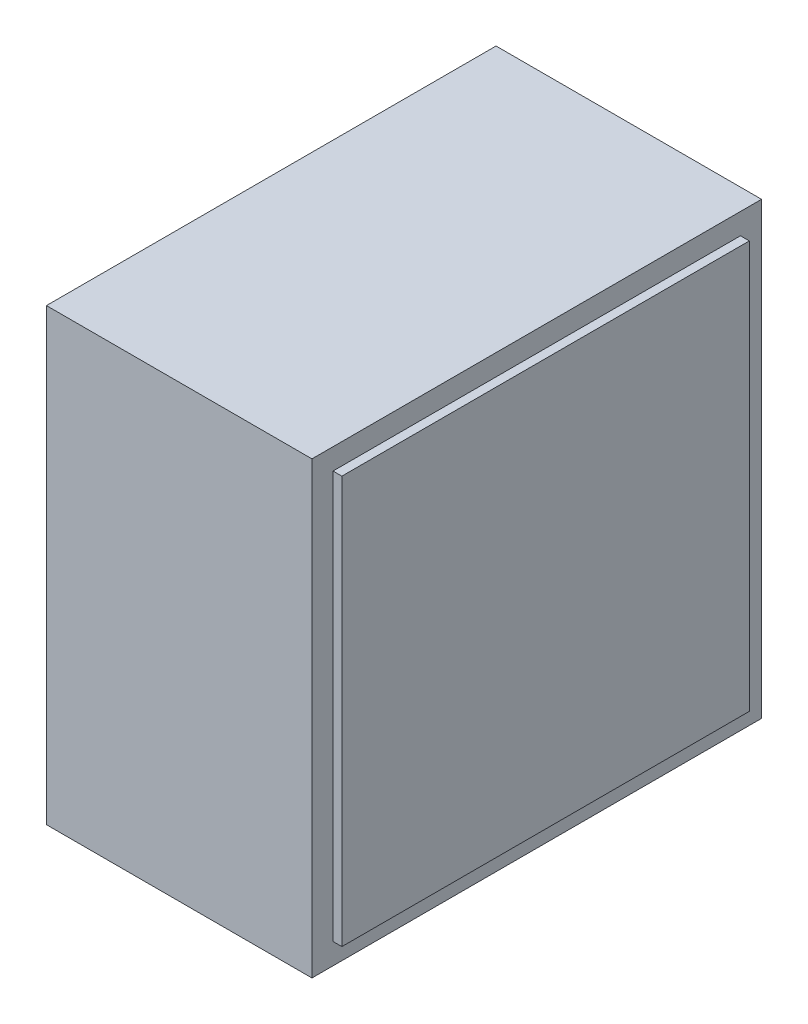
ISO-10303-21;
HEADER;
FILE_DESCRIPTION(('STEP AP214'),'2;1');
FILE_NAME('part.step','',(''),(''),'','','');
FILE_SCHEMA(('AUTOMOTIVE_DESIGN { 1 0 10303 214 1 1 1 1 }'));
ENDSEC;
DATA;
#1=APPLICATION_CONTEXT('core data for automotive mechanical design processes');
#2=APPLICATION_PROTOCOL_DEFINITION('international standard','automotive_design',2000,#1);
#3=PRODUCT_CONTEXT('',#1,'mechanical');
#4=PRODUCT('Part','Part','',(#3));
#5=PRODUCT_RELATED_PRODUCT_CATEGORY('part','',(#4));
#6=PRODUCT_DEFINITION_FORMATION('','',#4);
#7=PRODUCT_DEFINITION_CONTEXT('part definition',#1,'design');
#8=PRODUCT_DEFINITION('design','',#6,#7);
#9=PRODUCT_DEFINITION_SHAPE('','',#8);
#10=(LENGTH_UNIT() NAMED_UNIT(*) SI_UNIT(.MILLI.,.METRE.));
#11=(NAMED_UNIT(*) PLANE_ANGLE_UNIT() SI_UNIT($,.RADIAN.));
#12=(NAMED_UNIT(*) SI_UNIT($,.STERADIAN.) SOLID_ANGLE_UNIT());
#13=UNCERTAINTY_MEASURE_WITH_UNIT(LENGTH_MEASURE(1.E-05),#10,'distance_accuracy_value','');
#14=(GEOMETRIC_REPRESENTATION_CONTEXT(3) GLOBAL_UNCERTAINTY_ASSIGNED_CONTEXT((#13)) GLOBAL_UNIT_ASSIGNED_CONTEXT((#10,
#11,#12)) REPRESENTATION_CONTEXT('',''));
#15=CARTESIAN_POINT('',(0.,0.,0.));
#16=DIRECTION('',(0.,0.,1.));
#17=DIRECTION('',(1.,0.,0.));
#18=AXIS2_PLACEMENT_3D('',#15,#16,#17);
#19=CARTESIAN_POINT('',(62.,-46.0375,-46.0375));
#20=DIRECTION('',(0.,0.,1.));
#21=DIRECTION('',(0.,-1.,0.));
#22=AXIS2_PLACEMENT_3D('',#19,#20,#21);
#23=PLANE('',#22);
#24=DIRECTION('',(0.,1.,0.));
#25=VECTOR('',#24,1.);
#26=CARTESIAN_POINT('',(60.,-46.0375,-46.0375));
#27=LINE('',#26,#25);
#28=CARTESIAN_POINT('',(60.,-46.0375,-46.0375));
#29=VERTEX_POINT('',#28);
#30=CARTESIAN_POINT('',(60.,46.0375,-46.0375));
#31=VERTEX_POINT('',#30);
#32=EDGE_CURVE('E124',#29,#31,#27,.T.);
#33=ORIENTED_EDGE('',*,*,#32,.T.);
#34=DIRECTION('',(-1.,0.,0.));
#35=VECTOR('',#34,1.);
#36=CARTESIAN_POINT('',(62.,46.0375,-46.0375));
#37=LINE('',#36,#35);
#38=CARTESIAN_POINT('',(62.,46.0375,-46.0375));
#39=VERTEX_POINT('',#38);
#40=EDGE_CURVE('E12',#39,#31,#37,.T.);
#41=ORIENTED_EDGE('',*,*,#40,.F.);
#42=DIRECTION('',(0.,1.,0.));
#43=VECTOR('',#42,1.);
#44=CARTESIAN_POINT('',(62.,-46.0375,-46.0375));
#45=LINE('',#44,#43);
#46=CARTESIAN_POINT('',(62.,-46.0375,-46.0375));
#47=VERTEX_POINT('',#46);
#48=EDGE_CURVE('E108',#47,#39,#45,.T.);
#49=ORIENTED_EDGE('',*,*,#48,.F.);
#50=DIRECTION('',(-1.,0.,0.));
#51=VECTOR('',#50,1.);
#52=CARTESIAN_POINT('',(62.,-46.0375,-46.0375));
#53=LINE('',#52,#51);
#54=EDGE_CURVE('E117',#47,#29,#53,.T.);
#55=ORIENTED_EDGE('',*,*,#54,.T.);
#56=EDGE_LOOP('',(#33,#41,#49,#55));
#57=FACE_BOUND('',#56,.T.);
#58=ADVANCED_FACE('F59',(#57),#23,.F.);
#59=CARTESIAN_POINT('',(62.,46.0375,-46.0375));
#60=DIRECTION('',(0.,-1.,0.));
#61=DIRECTION('',(0.,0.,-1.));
#62=AXIS2_PLACEMENT_3D('',#59,#60,#61);
#63=PLANE('',#62);
#64=DIRECTION('',(0.,0.,1.));
#65=VECTOR('',#64,1.);
#66=CARTESIAN_POINT('',(60.,46.0375,-46.0375));
#67=LINE('',#66,#65);
#68=CARTESIAN_POINT('',(60.,46.0375,46.0375));
#69=VERTEX_POINT('',#68);
#70=EDGE_CURVE('E114',#31,#69,#67,.T.);
#71=ORIENTED_EDGE('',*,*,#70,.T.);
#72=DIRECTION('',(-1.,0.,0.));
#73=VECTOR('',#72,1.);
#74=CARTESIAN_POINT('',(62.,46.0375,46.0375));
#75=LINE('',#74,#73);
#76=CARTESIAN_POINT('',(62.,46.0375,46.0375));
#77=VERTEX_POINT('',#76);
#78=EDGE_CURVE('E69',#77,#69,#75,.T.);
#79=ORIENTED_EDGE('',*,*,#78,.F.);
#80=DIRECTION('',(0.,0.,1.));
#81=VECTOR('',#80,1.);
#82=CARTESIAN_POINT('',(62.,46.0375,-46.0375));
#83=LINE('',#82,#81);
#84=EDGE_CURVE('E102',#39,#77,#83,.T.);
#85=ORIENTED_EDGE('',*,*,#84,.F.);
#86=ORIENTED_EDGE('',*,*,#40,.T.);
#87=EDGE_LOOP('',(#71,#79,#85,#86));
#88=FACE_BOUND('',#87,.T.);
#89=ADVANCED_FACE('F115',(#88),#63,.F.);
#90=CARTESIAN_POINT('',(62.,46.0375,46.0375));
#91=DIRECTION('',(0.,0.,-1.));
#92=DIRECTION('',(-1.,0.,0.));
#93=AXIS2_PLACEMENT_3D('',#90,#91,#92);
#94=PLANE('',#93);
#95=DIRECTION('',(0.,-1.,0.));
#96=VECTOR('',#95,1.);
#97=CARTESIAN_POINT('',(60.,46.0375,46.0375));
#98=LINE('',#97,#96);
#99=CARTESIAN_POINT('',(60.,-46.0375,46.0375));
#100=VERTEX_POINT('',#99);
#101=EDGE_CURVE('E93',#69,#100,#98,.T.);
#102=ORIENTED_EDGE('',*,*,#101,.T.);
#103=DIRECTION('',(-1.,0.,0.));
#104=VECTOR('',#103,1.);
#105=CARTESIAN_POINT('',(62.,-46.0375,46.0375));
#106=LINE('',#105,#104);
#107=CARTESIAN_POINT('',(62.,-46.0375,46.0375));
#108=VERTEX_POINT('',#107);
#109=EDGE_CURVE('E111',#108,#100,#106,.T.);
#110=ORIENTED_EDGE('',*,*,#109,.F.);
#111=DIRECTION('',(0.,-1.,0.));
#112=VECTOR('',#111,1.);
#113=CARTESIAN_POINT('',(62.,46.0375,46.0375));
#114=LINE('',#113,#112);
#115=EDGE_CURVE('E110',#77,#108,#114,.T.);
#116=ORIENTED_EDGE('',*,*,#115,.F.);
#117=ORIENTED_EDGE('',*,*,#78,.T.);
#118=EDGE_LOOP('',(#102,#110,#116,#117));
#119=FACE_BOUND('',#118,.T.);
#120=ADVANCED_FACE('F113',(#119),#94,.F.);
#121=CARTESIAN_POINT('',(62.,-46.0375,46.0375));
#122=DIRECTION('',(0.,1.,0.));
#123=DIRECTION('',(0.,0.,1.));
#124=AXIS2_PLACEMENT_3D('',#121,#122,#123);
#125=PLANE('',#124);
#126=DIRECTION('',(0.,0.,-1.));
#127=VECTOR('',#126,1.);
#128=CARTESIAN_POINT('',(60.,-46.0375,46.0375));
#129=LINE('',#128,#127);
#130=EDGE_CURVE('E100',#100,#29,#129,.T.);
#131=ORIENTED_EDGE('',*,*,#130,.T.);
#132=ORIENTED_EDGE('',*,*,#54,.F.);
#133=DIRECTION('',(0.,0.,-1.));
#134=VECTOR('',#133,1.);
#135=CARTESIAN_POINT('',(62.,-46.0375,46.0375));
#136=LINE('',#135,#134);
#137=EDGE_CURVE('E74',#108,#47,#136,.T.);
#138=ORIENTED_EDGE('',*,*,#137,.F.);
#139=ORIENTED_EDGE('',*,*,#109,.T.);
#140=EDGE_LOOP('',(#131,#132,#138,#139));
#141=FACE_BOUND('',#140,.T.);
#142=ADVANCED_FACE('F126',(#141),#125,.F.);
#143=CARTESIAN_POINT('',(62.,0.,0.));
#144=DIRECTION('',(1.,0.,0.));
#145=DIRECTION('',(0.,0.,-1.));
#146=AXIS2_PLACEMENT_3D('',#143,#144,#145);
#147=PLANE('',#146);
#148=ORIENTED_EDGE('',*,*,#48,.T.);
#149=ORIENTED_EDGE('',*,*,#84,.T.);
#150=ORIENTED_EDGE('',*,*,#115,.T.);
#151=ORIENTED_EDGE('',*,*,#137,.T.);
#152=EDGE_LOOP('',(#148,#149,#150,#151));
#153=FACE_BOUND('',#152,.T.);
#154=ADVANCED_FACE('F104',(#153),#147,.T.);
#155=CARTESIAN_POINT('',(60.,0.,0.));
#156=DIRECTION('',(1.,0.,0.));
#157=DIRECTION('',(0.,0.,-1.));
#158=AXIS2_PLACEMENT_3D('',#155,#156,#157);
#159=PLANE('',#158);
#160=ORIENTED_EDGE('',*,*,#32,.F.);
#161=ORIENTED_EDGE('',*,*,#130,.F.);
#162=ORIENTED_EDGE('',*,*,#101,.F.);
#163=ORIENTED_EDGE('',*,*,#70,.F.);
#164=EDGE_LOOP('',(#160,#161,#162,#163));
#165=FACE_BOUND('',#164,.T.);
#166=ADVANCED_FACE('F131',(#165),#159,.F.);
#167=CLOSED_SHELL('',(#58,#89,#120,#142,#154,#166));
#168=MANIFOLD_SOLID_BREP('B2',#167);
#169=CARTESIAN_POINT('',(-2.,-46.0375,46.0375));
#170=DIRECTION('',(0.,0.,-1.));
#171=DIRECTION('',(-1.,0.,0.));
#172=AXIS2_PLACEMENT_3D('',#169,#170,#171);
#173=PLANE('',#172);
#174=DIRECTION('',(0.,1.,0.));
#175=VECTOR('',#174,1.);
#176=CARTESIAN_POINT('',(0.,-46.0375,46.0375));
#177=LINE('',#176,#175);
#178=CARTESIAN_POINT('',(0.,-46.0375,46.0375));
#179=VERTEX_POINT('',#178);
#180=CARTESIAN_POINT('',(0.,46.0375,46.0375));
#181=VERTEX_POINT('',#180);
#182=EDGE_CURVE('E255',#179,#181,#177,.T.);
#183=ORIENTED_EDGE('',*,*,#182,.T.);
#184=DIRECTION('',(1.,0.,0.));
#185=VECTOR('',#184,1.);
#186=CARTESIAN_POINT('',(-2.,46.0375,46.0375));
#187=LINE('',#186,#185);
#188=CARTESIAN_POINT('',(-2.,46.0375,46.0375));
#189=VERTEX_POINT('',#188);
#190=EDGE_CURVE('E57',#189,#181,#187,.T.);
#191=ORIENTED_EDGE('',*,*,#190,.F.);
#192=DIRECTION('',(0.,1.,0.));
#193=VECTOR('',#192,1.);
#194=CARTESIAN_POINT('',(-2.,-46.0375,46.0375));
#195=LINE('',#194,#193);
#196=CARTESIAN_POINT('',(-2.,-46.0375,46.0375));
#197=VERTEX_POINT('',#196);
#198=EDGE_CURVE('E242',#197,#189,#195,.T.);
#199=ORIENTED_EDGE('',*,*,#198,.F.);
#200=DIRECTION('',(1.,0.,0.));
#201=VECTOR('',#200,1.);
#202=CARTESIAN_POINT('',(-2.,-46.0375,46.0375));
#203=LINE('',#202,#201);
#204=EDGE_CURVE('E247',#197,#179,#203,.T.);
#205=ORIENTED_EDGE('',*,*,#204,.T.);
#206=EDGE_LOOP('',(#183,#191,#199,#205));
#207=FACE_BOUND('',#206,.T.);
#208=ADVANCED_FACE('F194',(#207),#173,.F.);
#209=CARTESIAN_POINT('',(-2.,46.0375,46.0375));
#210=DIRECTION('',(0.,-1.,0.));
#211=DIRECTION('',(0.,0.,-1.));
#212=AXIS2_PLACEMENT_3D('',#209,#210,#211);
#213=PLANE('',#212);
#214=DIRECTION('',(0.,0.,-1.));
#215=VECTOR('',#214,1.);
#216=CARTESIAN_POINT('',(0.,46.0375,46.0375));
#217=LINE('',#216,#215);
#218=CARTESIAN_POINT('',(0.,46.0375,-46.0375));
#219=VERTEX_POINT('',#218);
#220=EDGE_CURVE('E249',#181,#219,#217,.T.);
#221=ORIENTED_EDGE('',*,*,#220,.T.);
#222=DIRECTION('',(1.,0.,0.));
#223=VECTOR('',#222,1.);
#224=CARTESIAN_POINT('',(-2.,46.0375,-46.0375));
#225=LINE('',#224,#223);
#226=CARTESIAN_POINT('',(-2.,46.0375,-46.0375));
#227=VERTEX_POINT('',#226);
#228=EDGE_CURVE('E200',#227,#219,#225,.T.);
#229=ORIENTED_EDGE('',*,*,#228,.F.);
#230=DIRECTION('',(0.,0.,-1.));
#231=VECTOR('',#230,1.);
#232=CARTESIAN_POINT('',(-2.,46.0375,46.0375));
#233=LINE('',#232,#231);
#234=EDGE_CURVE('E240',#189,#227,#233,.T.);
#235=ORIENTED_EDGE('',*,*,#234,.F.);
#236=ORIENTED_EDGE('',*,*,#190,.T.);
#237=EDGE_LOOP('',(#221,#229,#235,#236));
#238=FACE_BOUND('',#237,.T.);
#239=ADVANCED_FACE('F245',(#238),#213,.F.);
#240=CARTESIAN_POINT('',(-2.,46.0375,-46.0375));
#241=DIRECTION('',(0.,0.,1.));
#242=DIRECTION('',(0.,-1.,0.));
#243=AXIS2_PLACEMENT_3D('',#240,#241,#242);
#244=PLANE('',#243);
#245=DIRECTION('',(0.,-1.,0.));
#246=VECTOR('',#245,1.);
#247=CARTESIAN_POINT('',(0.,46.0375,-46.0375));
#248=LINE('',#247,#246);
#249=CARTESIAN_POINT('',(0.,-46.0375,-46.0375));
#250=VERTEX_POINT('',#249);
#251=EDGE_CURVE('E221',#219,#250,#248,.T.);
#252=ORIENTED_EDGE('',*,*,#251,.T.);
#253=DIRECTION('',(1.,0.,0.));
#254=VECTOR('',#253,1.);
#255=CARTESIAN_POINT('',(-2.,-46.0375,-46.0375));
#256=LINE('',#255,#254);
#257=CARTESIAN_POINT('',(-2.,-46.0375,-46.0375));
#258=VERTEX_POINT('',#257);
#259=EDGE_CURVE('E246',#258,#250,#256,.T.);
#260=ORIENTED_EDGE('',*,*,#259,.F.);
#261=DIRECTION('',(0.,-1.,0.));
#262=VECTOR('',#261,1.);
#263=CARTESIAN_POINT('',(-2.,46.0375,-46.0375));
#264=LINE('',#263,#262);
#265=EDGE_CURVE('E238',#227,#258,#264,.T.);
#266=ORIENTED_EDGE('',*,*,#265,.F.);
#267=ORIENTED_EDGE('',*,*,#228,.T.);
#268=EDGE_LOOP('',(#252,#260,#266,#267));
#269=FACE_BOUND('',#268,.T.);
#270=ADVANCED_FACE('F250',(#269),#244,.F.);
#271=CARTESIAN_POINT('',(-2.,-46.0375,-46.0375));
#272=DIRECTION('',(0.,1.,0.));
#273=DIRECTION('',(0.,0.,1.));
#274=AXIS2_PLACEMENT_3D('',#271,#272,#273);
#275=PLANE('',#274);
#276=DIRECTION('',(0.,0.,1.));
#277=VECTOR('',#276,1.);
#278=CARTESIAN_POINT('',(0.,-46.0375,-46.0375));
#279=LINE('',#278,#277);
#280=EDGE_CURVE('E230',#250,#179,#279,.T.);
#281=ORIENTED_EDGE('',*,*,#280,.T.);
#282=ORIENTED_EDGE('',*,*,#204,.F.);
#283=DIRECTION('',(0.,0.,1.));
#284=VECTOR('',#283,1.);
#285=CARTESIAN_POINT('',(-2.,-46.0375,-46.0375));
#286=LINE('',#285,#284);
#287=EDGE_CURVE('E210',#258,#197,#286,.T.);
#288=ORIENTED_EDGE('',*,*,#287,.F.);
#289=ORIENTED_EDGE('',*,*,#259,.T.);
#290=EDGE_LOOP('',(#281,#282,#288,#289));
#291=FACE_BOUND('',#290,.T.);
#292=ADVANCED_FACE('F261',(#291),#275,.F.);
#293=CARTESIAN_POINT('',(-2.,0.,0.));
#294=DIRECTION('',(-1.,0.,0.));
#295=DIRECTION('',(0.,0.,1.));
#296=AXIS2_PLACEMENT_3D('',#293,#294,#295);
#297=PLANE('',#296);
#298=ORIENTED_EDGE('',*,*,#198,.T.);
#299=ORIENTED_EDGE('',*,*,#234,.T.);
#300=ORIENTED_EDGE('',*,*,#265,.T.);
#301=ORIENTED_EDGE('',*,*,#287,.T.);
#302=EDGE_LOOP('',(#298,#299,#300,#301));
#303=FACE_BOUND('',#302,.T.);
#304=ADVANCED_FACE('F236',(#303),#297,.T.);
#305=CARTESIAN_POINT('',(0.,0.,0.));
#306=DIRECTION('',(-1.,0.,0.));
#307=DIRECTION('',(0.,0.,1.));
#308=AXIS2_PLACEMENT_3D('',#305,#306,#307);
#309=PLANE('',#308);
#310=ORIENTED_EDGE('',*,*,#182,.F.);
#311=ORIENTED_EDGE('',*,*,#280,.F.);
#312=ORIENTED_EDGE('',*,*,#251,.F.);
#313=ORIENTED_EDGE('',*,*,#220,.F.);
#314=EDGE_LOOP('',(#310,#311,#312,#313));
#315=FACE_BOUND('',#314,.T.);
#316=ADVANCED_FACE('F262',(#315),#309,.F.);
#317=CLOSED_SHELL('',(#208,#239,#270,#292,#304,#316));
#318=MANIFOLD_SOLID_BREP('B6',#317);
#319=CARTESIAN_POINT('',(60.,50.8,50.8));
#320=DIRECTION('',(0.,-1.,0.));
#321=DIRECTION('',(0.,0.,-1.));
#322=AXIS2_PLACEMENT_3D('',#319,#320,#321);
#323=PLANE('',#322);
#324=DIRECTION('',(0.,0.,1.));
#325=VECTOR('',#324,1.);
#326=CARTESIAN_POINT('',(0.,50.8,50.8));
#327=LINE('',#326,#325);
#328=CARTESIAN_POINT('',(0.,50.8,-50.8));
#329=VERTEX_POINT('',#328);
#330=CARTESIAN_POINT('',(0.,50.8,50.8));
#331=VERTEX_POINT('',#330);
#332=EDGE_CURVE('E425',#329,#331,#327,.T.);
#333=ORIENTED_EDGE('',*,*,#332,.T.);
#334=DIRECTION('',(-1.,0.,0.));
#335=VECTOR('',#334,1.);
#336=CARTESIAN_POINT('',(60.,50.8,50.8));
#337=LINE('',#336,#335);
#338=CARTESIAN_POINT('',(60.,50.8,50.8));
#339=VERTEX_POINT('',#338);
#340=EDGE_CURVE('E188',#339,#331,#337,.T.);
#341=ORIENTED_EDGE('',*,*,#340,.F.);
#342=DIRECTION('',(0.,0.,1.));
#343=VECTOR('',#342,1.);
#344=CARTESIAN_POINT('',(60.,50.8,50.8));
#345=LINE('',#344,#343);
#346=CARTESIAN_POINT('',(60.,50.8,-50.8));
#347=VERTEX_POINT('',#346);
#348=EDGE_CURVE('E399',#347,#339,#345,.T.);
#349=ORIENTED_EDGE('',*,*,#348,.F.);
#350=DIRECTION('',(-1.,0.,0.));
#351=VECTOR('',#350,1.);
#352=CARTESIAN_POINT('',(60.,50.8,-50.8));
#353=LINE('',#352,#351);
#354=EDGE_CURVE('E427',#347,#329,#353,.T.);
#355=ORIENTED_EDGE('',*,*,#354,.T.);
#356=EDGE_LOOP('',(#333,#341,#349,#355));
#357=FACE_BOUND('',#356,.T.);
#358=ADVANCED_FACE('F312',(#357),#323,.F.);
#359=CARTESIAN_POINT('',(60.,50.8,50.8));
#360=DIRECTION('',(0.,0.,-1.));
#361=DIRECTION('',(-1.,0.,0.));
#362=AXIS2_PLACEMENT_3D('',#359,#360,#361);
#363=PLANE('',#362);
#364=DIRECTION('',(0.,-1.,0.));
#365=VECTOR('',#364,1.);
#366=CARTESIAN_POINT('',(0.,50.8,50.8));
#367=LINE('',#366,#365);
#368=CARTESIAN_POINT('',(0.,-50.8,50.8));
#369=VERTEX_POINT('',#368);
#370=EDGE_CURVE('E402',#331,#369,#367,.T.);
#371=ORIENTED_EDGE('',*,*,#370,.T.);
#372=DIRECTION('',(-1.,0.,0.));
#373=VECTOR('',#372,1.);
#374=CARTESIAN_POINT('',(60.,-50.8,50.8));
#375=LINE('',#374,#373);
#376=CARTESIAN_POINT('',(60.,-50.8,50.8));
#377=VERTEX_POINT('',#376);
#378=EDGE_CURVE('E324',#377,#369,#375,.T.);
#379=ORIENTED_EDGE('',*,*,#378,.F.);
#380=DIRECTION('',(0.,-1.,0.));
#381=VECTOR('',#380,1.);
#382=CARTESIAN_POINT('',(60.,50.8,50.8));
#383=LINE('',#382,#381);
#384=EDGE_CURVE('E388',#339,#377,#383,.T.);
#385=ORIENTED_EDGE('',*,*,#384,.F.);
#386=ORIENTED_EDGE('',*,*,#340,.T.);
#387=EDGE_LOOP('',(#371,#379,#385,#386));
#388=FACE_BOUND('',#387,.T.);
#389=ADVANCED_FACE('F397',(#388),#363,.F.);
#390=CARTESIAN_POINT('',(60.,-50.8,-50.8));
#391=DIRECTION('',(0.,1.,0.));
#392=DIRECTION('',(0.,0.,1.));
#393=AXIS2_PLACEMENT_3D('',#390,#391,#392);
#394=PLANE('',#393);
#395=DIRECTION('',(0.,0.,-1.));
#396=VECTOR('',#395,1.);
#397=CARTESIAN_POINT('',(0.,-50.8,-50.8));
#398=LINE('',#397,#396);
#399=CARTESIAN_POINT('',(0.,-50.8,-50.8));
#400=VERTEX_POINT('',#399);
#401=EDGE_CURVE('E361',#369,#400,#398,.T.);
#402=ORIENTED_EDGE('',*,*,#401,.T.);
#403=DIRECTION('',(-1.,0.,0.));
#404=VECTOR('',#403,1.);
#405=CARTESIAN_POINT('',(60.,-50.8,-50.8));
#406=LINE('',#405,#404);
#407=CARTESIAN_POINT('',(60.,-50.8,-50.8));
#408=VERTEX_POINT('',#407);
#409=EDGE_CURVE('E405',#408,#400,#406,.T.);
#410=ORIENTED_EDGE('',*,*,#409,.F.);
#411=DIRECTION('',(0.,0.,-1.));
#412=VECTOR('',#411,1.);
#413=CARTESIAN_POINT('',(60.,-50.8,-50.8));
#414=LINE('',#413,#412);
#415=EDGE_CURVE('E393',#377,#408,#414,.T.);
#416=ORIENTED_EDGE('',*,*,#415,.F.);
#417=ORIENTED_EDGE('',*,*,#378,.T.);
#418=EDGE_LOOP('',(#402,#410,#416,#417));
#419=FACE_BOUND('',#418,.T.);
#420=ADVANCED_FACE('F404',(#419),#394,.F.);
#421=CARTESIAN_POINT('',(60.,46.0375,46.0375));
#422=DIRECTION('',(0.,0.,-1.));
#423=DIRECTION('',(-1.,0.,0.));
#424=AXIS2_PLACEMENT_3D('',#421,#422,#423);
#425=PLANE('',#424);
#426=DIRECTION('',(0.,-1.,0.));
#427=VECTOR('',#426,1.);
#428=CARTESIAN_POINT('',(0.,46.0375,46.0375));
#429=LINE('',#428,#427);
#430=CARTESIAN_POINT('',(0.,46.0375,46.0375));
#431=VERTEX_POINT('',#430);
#432=CARTESIAN_POINT('',(0.,-46.0375,46.0375));
#433=VERTEX_POINT('',#432);
#434=EDGE_CURVE('E410',#431,#433,#429,.T.);
#435=ORIENTED_EDGE('',*,*,#434,.F.);
#436=DIRECTION('',(-1.,0.,0.));
#437=VECTOR('',#436,1.);
#438=CARTESIAN_POINT('',(60.,46.0375,46.0375));
#439=LINE('',#438,#437);
#440=CARTESIAN_POINT('',(60.,46.0375,46.0375));
#441=VERTEX_POINT('',#440);
#442=EDGE_CURVE('E317',#441,#431,#439,.T.);
#443=ORIENTED_EDGE('',*,*,#442,.F.);
#444=DIRECTION('',(0.,-1.,0.));
#445=VECTOR('',#444,1.);
#446=CARTESIAN_POINT('',(60.,46.0375,46.0375));
#447=LINE('',#446,#445);
#448=CARTESIAN_POINT('',(60.,-46.0375,46.0375));
#449=VERTEX_POINT('',#448);
#450=EDGE_CURVE('E428',#441,#449,#447,.T.);
#451=ORIENTED_EDGE('',*,*,#450,.T.);
#452=DIRECTION('',(-1.,0.,0.));
#453=VECTOR('',#452,1.);
#454=CARTESIAN_POINT('',(60.,-46.0375,46.0375));
#455=LINE('',#454,#453);
#456=EDGE_CURVE('E406',#449,#433,#455,.T.);
#457=ORIENTED_EDGE('',*,*,#456,.T.);
#458=EDGE_LOOP('',(#435,#443,#451,#457));
#459=FACE_BOUND('',#458,.T.);
#460=ADVANCED_FACE('F320',(#459),#425,.T.);
#461=CARTESIAN_POINT('',(60.,46.0375,46.0375));
#462=DIRECTION('',(0.,-1.,0.));
#463=DIRECTION('',(0.,0.,-1.));
#464=AXIS2_PLACEMENT_3D('',#461,#462,#463);
#465=PLANE('',#464);
#466=DIRECTION('',(0.,0.,1.));
#467=VECTOR('',#466,1.);
#468=CARTESIAN_POINT('',(0.,46.0375,46.0375));
#469=LINE('',#468,#467);
#470=CARTESIAN_POINT('',(0.,46.0375,-46.0375));
#471=VERTEX_POINT('',#470);
#472=EDGE_CURVE('E415',#471,#431,#469,.T.);
#473=ORIENTED_EDGE('',*,*,#472,.F.);
#474=DIRECTION('',(-1.,0.,0.));
#475=VECTOR('',#474,1.);
#476=CARTESIAN_POINT('',(60.,46.0375,-46.0375));
#477=LINE('',#476,#475);
#478=CARTESIAN_POINT('',(60.,46.0375,-46.0375));
#479=VERTEX_POINT('',#478);
#480=EDGE_CURVE('E432',#479,#471,#477,.T.);
#481=ORIENTED_EDGE('',*,*,#480,.F.);
#482=DIRECTION('',(0.,0.,1.));
#483=VECTOR('',#482,1.);
#484=CARTESIAN_POINT('',(60.,46.0375,46.0375));
#485=LINE('',#484,#483);
#486=EDGE_CURVE('E444',#479,#441,#485,.T.);
#487=ORIENTED_EDGE('',*,*,#486,.T.);
#488=ORIENTED_EDGE('',*,*,#442,.T.);
#489=EDGE_LOOP('',(#473,#481,#487,#488));
#490=FACE_BOUND('',#489,.T.);
#491=ADVANCED_FACE('F442',(#490),#465,.T.);
#492=CARTESIAN_POINT('',(60.,-46.0375,-46.0375));
#493=DIRECTION('',(0.,0.,1.));
#494=DIRECTION('',(1.,0.,0.));
#495=AXIS2_PLACEMENT_3D('',#492,#493,#494);
#496=PLANE('',#495);
#497=DIRECTION('',(0.,1.,0.));
#498=VECTOR('',#497,1.);
#499=CARTESIAN_POINT('',(0.,-46.0375,-46.0375));
#500=LINE('',#499,#498);
#501=CARTESIAN_POINT('',(0.,-46.0375,-46.0375));
#502=VERTEX_POINT('',#501);
#503=EDGE_CURVE('E418',#502,#471,#500,.T.);
#504=ORIENTED_EDGE('',*,*,#503,.F.);
#505=DIRECTION('',(-1.,0.,0.));
#506=VECTOR('',#505,1.);
#507=CARTESIAN_POINT('',(60.,-46.0375,-46.0375));
#508=LINE('',#507,#506);
#509=CARTESIAN_POINT('',(60.,-46.0375,-46.0375));
#510=VERTEX_POINT('',#509);
#511=EDGE_CURVE('E433',#510,#502,#508,.T.);
#512=ORIENTED_EDGE('',*,*,#511,.F.);
#513=DIRECTION('',(0.,1.,0.));
#514=VECTOR('',#513,1.);
#515=CARTESIAN_POINT('',(60.,-46.0375,-46.0375));
#516=LINE('',#515,#514);
#517=EDGE_CURVE('E450',#510,#479,#516,.T.);
#518=ORIENTED_EDGE('',*,*,#517,.T.);
#519=ORIENTED_EDGE('',*,*,#480,.T.);
#520=EDGE_LOOP('',(#504,#512,#518,#519));
#521=FACE_BOUND('',#520,.T.);
#522=ADVANCED_FACE('F449',(#521),#496,.T.);
#523=CARTESIAN_POINT('',(60.,-46.0375,-46.0375));
#524=DIRECTION('',(0.,1.,0.));
#525=DIRECTION('',(0.,0.,1.));
#526=AXIS2_PLACEMENT_3D('',#523,#524,#525);
#527=PLANE('',#526);
#528=DIRECTION('',(0.,0.,-1.));
#529=VECTOR('',#528,1.);
#530=CARTESIAN_POINT('',(0.,-46.0375,-46.0375));
#531=LINE('',#530,#529);
#532=EDGE_CURVE('E420',#433,#502,#531,.T.);
#533=ORIENTED_EDGE('',*,*,#532,.F.);
#534=ORIENTED_EDGE('',*,*,#456,.F.);
#535=DIRECTION('',(0.,0.,-1.));
#536=VECTOR('',#535,1.);
#537=CARTESIAN_POINT('',(60.,-46.0375,-46.0375));
#538=LINE('',#537,#536);
#539=EDGE_CURVE('E452',#449,#510,#538,.T.);
#540=ORIENTED_EDGE('',*,*,#539,.T.);
#541=ORIENTED_EDGE('',*,*,#511,.T.);
#542=EDGE_LOOP('',(#533,#534,#540,#541));
#543=FACE_BOUND('',#542,.T.);
#544=ADVANCED_FACE('F460',(#543),#527,.T.);
#545=CARTESIAN_POINT('',(60.,-50.8,-50.8));
#546=DIRECTION('',(0.,0.,1.));
#547=DIRECTION('',(0.,-1.,0.));
#548=AXIS2_PLACEMENT_3D('',#545,#546,#547);
#549=PLANE('',#548);
#550=DIRECTION('',(0.,1.,0.));
#551=VECTOR('',#550,1.);
#552=CARTESIAN_POINT('',(0.,-50.8,-50.8));
#553=LINE('',#552,#551);
#554=EDGE_CURVE('E369',#400,#329,#553,.T.);
#555=ORIENTED_EDGE('',*,*,#554,.T.);
#556=ORIENTED_EDGE('',*,*,#354,.F.);
#557=DIRECTION('',(0.,1.,0.));
#558=VECTOR('',#557,1.);
#559=CARTESIAN_POINT('',(60.,-50.8,-50.8));
#560=LINE('',#559,#558);
#561=EDGE_CURVE('E331',#408,#347,#560,.T.);
#562=ORIENTED_EDGE('',*,*,#561,.F.);
#563=ORIENTED_EDGE('',*,*,#409,.T.);
#564=EDGE_LOOP('',(#555,#556,#562,#563));
#565=FACE_BOUND('',#564,.T.);
#566=ADVANCED_FACE('F462',(#565),#549,.F.);
#567=CARTESIAN_POINT('',(60.,0.,0.));
#568=DIRECTION('',(1.,0.,0.));
#569=DIRECTION('',(0.,0.,-1.));
#570=AXIS2_PLACEMENT_3D('',#567,#568,#569);
#571=PLANE('',#570);
#572=ORIENTED_EDGE('',*,*,#450,.F.);
#573=ORIENTED_EDGE('',*,*,#486,.F.);
#574=ORIENTED_EDGE('',*,*,#517,.F.);
#575=ORIENTED_EDGE('',*,*,#539,.F.);
#576=EDGE_LOOP('',(#572,#573,#574,#575));
#577=FACE_BOUND('',#576,.T.);
#578=ORIENTED_EDGE('',*,*,#348,.T.);
#579=ORIENTED_EDGE('',*,*,#384,.T.);
#580=ORIENTED_EDGE('',*,*,#415,.T.);
#581=ORIENTED_EDGE('',*,*,#561,.T.);
#582=EDGE_LOOP('',(#578,#579,#580,#581));
#583=FACE_BOUND('',#582,.T.);
#584=ADVANCED_FACE('F392',(#577,#583),#571,.T.);
#585=CARTESIAN_POINT('',(0.,0.,0.));
#586=DIRECTION('',(1.,0.,0.));
#587=DIRECTION('',(0.,0.,-1.));
#588=AXIS2_PLACEMENT_3D('',#585,#586,#587);
#589=PLANE('',#588);
#590=ORIENTED_EDGE('',*,*,#434,.T.);
#591=ORIENTED_EDGE('',*,*,#532,.T.);
#592=ORIENTED_EDGE('',*,*,#503,.T.);
#593=ORIENTED_EDGE('',*,*,#472,.T.);
#594=EDGE_LOOP('',(#590,#591,#592,#593));
#595=FACE_BOUND('',#594,.T.);
#596=ORIENTED_EDGE('',*,*,#332,.F.);
#597=ORIENTED_EDGE('',*,*,#554,.F.);
#598=ORIENTED_EDGE('',*,*,#401,.F.);
#599=ORIENTED_EDGE('',*,*,#370,.F.);
#600=EDGE_LOOP('',(#596,#597,#598,#599));
#601=FACE_BOUND('',#600,.T.);
#602=ADVANCED_FACE('F446',(#595,#601),#589,.F.);
#603=CLOSED_SHELL('',(#358,#389,#420,#460,#491,#522,#544,#566,#584,#602));
#604=MANIFOLD_SOLID_BREP('B49',#603);
#605=ADVANCED_BREP_SHAPE_REPRESENTATION('',(#18,#168,#318,#604),#14);
#606=SHAPE_DEFINITION_REPRESENTATION(#9,#605);
ENDSEC;
END-ISO-10303-21;
